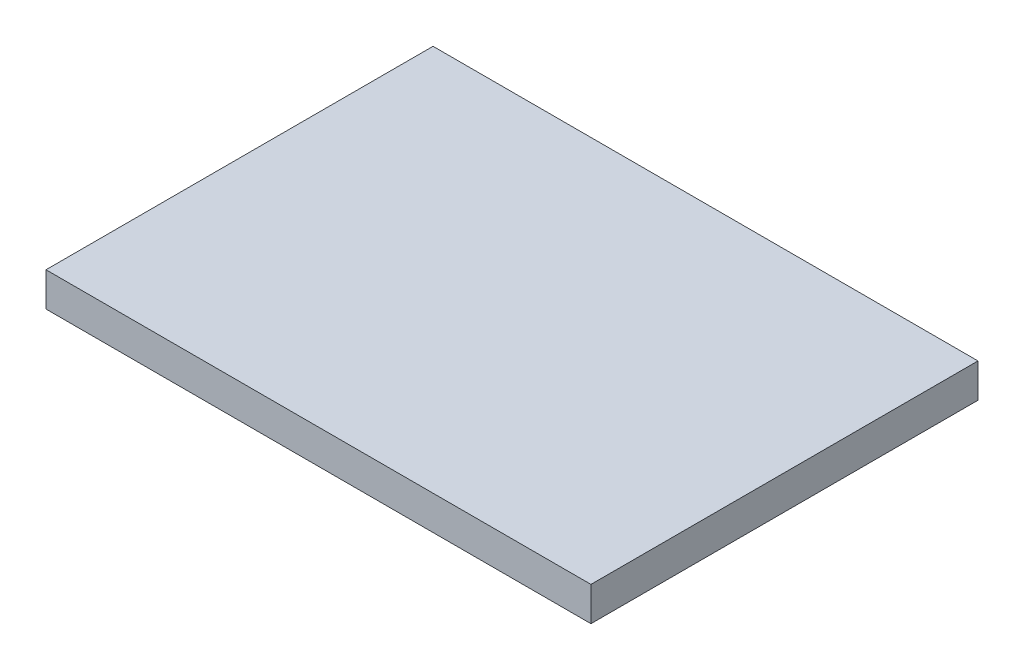
ISO-10303-21;
HEADER;
FILE_DESCRIPTION(('STEP AP214'),'2;1');
FILE_NAME('part.step','',(''),(''),'','','');
FILE_SCHEMA(('AUTOMOTIVE_DESIGN { 1 0 10303 214 1 1 1 1 }'));
ENDSEC;
DATA;
#1=APPLICATION_CONTEXT('core data for automotive mechanical design processes');
#2=APPLICATION_PROTOCOL_DEFINITION('international standard','automotive_design',2000,#1);
#3=PRODUCT_CONTEXT('',#1,'mechanical');
#4=PRODUCT('Part','Part','',(#3));
#5=PRODUCT_RELATED_PRODUCT_CATEGORY('part','',(#4));
#6=PRODUCT_DEFINITION_FORMATION('','',#4);
#7=PRODUCT_DEFINITION_CONTEXT('part definition',#1,'design');
#8=PRODUCT_DEFINITION('design','',#6,#7);
#9=PRODUCT_DEFINITION_SHAPE('','',#8);
#10=(LENGTH_UNIT() NAMED_UNIT(*) SI_UNIT(.MILLI.,.METRE.));
#11=(NAMED_UNIT(*) PLANE_ANGLE_UNIT() SI_UNIT($,.RADIAN.));
#12=(NAMED_UNIT(*) SI_UNIT($,.STERADIAN.) SOLID_ANGLE_UNIT());
#13=UNCERTAINTY_MEASURE_WITH_UNIT(LENGTH_MEASURE(1.E-05),#10,'distance_accuracy_value','');
#14=(GEOMETRIC_REPRESENTATION_CONTEXT(3) GLOBAL_UNCERTAINTY_ASSIGNED_CONTEXT((#13)) GLOBAL_UNIT_ASSIGNED_CONTEXT((#10,
#11,#12)) REPRESENTATION_CONTEXT('',''));
#15=CARTESIAN_POINT('',(0.,0.,0.));
#16=DIRECTION('',(0.,0.,1.));
#17=DIRECTION('',(1.,0.,0.));
#18=AXIS2_PLACEMENT_3D('',#15,#16,#17);
#19=CARTESIAN_POINT('',(8.8,1.1,6.25));
#20=DIRECTION('',(-1.,0.,0.));
#21=DIRECTION('',(0.,0.,1.));
#22=AXIS2_PLACEMENT_3D('',#19,#20,#21);
#23=PLANE('',#22);
#24=DIRECTION('',(0.,0.,-1.));
#25=VECTOR('',#24,1.);
#26=CARTESIAN_POINT('',(8.8,0.,6.25));
#27=LINE('',#26,#25);
#28=CARTESIAN_POINT('',(8.8,0.,6.25));
#29=VERTEX_POINT('',#28);
#30=CARTESIAN_POINT('',(8.8,0.,-6.25));
#31=VERTEX_POINT('',#30);
#32=EDGE_CURVE('E106',#29,#31,#27,.T.);
#33=ORIENTED_EDGE('',*,*,#32,.T.);
#34=DIRECTION('',(0.,-1.,0.));
#35=VECTOR('',#34,1.);
#36=CARTESIAN_POINT('',(8.8,1.1,-6.25));
#37=LINE('',#36,#35);
#38=CARTESIAN_POINT('',(8.8,1.1,-6.25));
#39=VERTEX_POINT('',#38);
#40=EDGE_CURVE('E11',#39,#31,#37,.T.);
#41=ORIENTED_EDGE('',*,*,#40,.F.);
#42=DIRECTION('',(0.,0.,-1.));
#43=VECTOR('',#42,1.);
#44=CARTESIAN_POINT('',(8.8,1.1,6.25));
#45=LINE('',#44,#43);
#46=CARTESIAN_POINT('',(8.8,1.1,6.25));
#47=VERTEX_POINT('',#46);
#48=EDGE_CURVE('E94',#47,#39,#45,.T.);
#49=ORIENTED_EDGE('',*,*,#48,.F.);
#50=DIRECTION('',(0.,-1.,0.));
#51=VECTOR('',#50,1.);
#52=CARTESIAN_POINT('',(8.8,1.1,6.25));
#53=LINE('',#52,#51);
#54=EDGE_CURVE('E102',#47,#29,#53,.T.);
#55=ORIENTED_EDGE('',*,*,#54,.T.);
#56=EDGE_LOOP('',(#33,#41,#49,#55));
#57=FACE_BOUND('',#56,.T.);
#58=ADVANCED_FACE('F43',(#57),#23,.F.);
#59=CARTESIAN_POINT('',(-8.8,1.1,-6.25));
#60=DIRECTION('',(0.,0.,1.));
#61=DIRECTION('',(1.,0.,0.));
#62=AXIS2_PLACEMENT_3D('',#59,#60,#61);
#63=PLANE('',#62);
#64=DIRECTION('',(-1.,0.,0.));
#65=VECTOR('',#64,1.);
#66=CARTESIAN_POINT('',(-8.8,0.,-6.25));
#67=LINE('',#66,#65);
#68=CARTESIAN_POINT('',(-8.8,0.,-6.25));
#69=VERTEX_POINT('',#68);
#70=EDGE_CURVE('E98',#31,#69,#67,.T.);
#71=ORIENTED_EDGE('',*,*,#70,.T.);
#72=DIRECTION('',(0.,-1.,0.));
#73=VECTOR('',#72,1.);
#74=CARTESIAN_POINT('',(-8.8,1.1,-6.25));
#75=LINE('',#74,#73);
#76=CARTESIAN_POINT('',(-8.8,1.1,-6.25));
#77=VERTEX_POINT('',#76);
#78=EDGE_CURVE('E51',#77,#69,#75,.T.);
#79=ORIENTED_EDGE('',*,*,#78,.F.);
#80=DIRECTION('',(-1.,0.,0.));
#81=VECTOR('',#80,1.);
#82=CARTESIAN_POINT('',(-8.8,1.1,-6.25));
#83=LINE('',#82,#81);
#84=EDGE_CURVE('E89',#39,#77,#83,.T.);
#85=ORIENTED_EDGE('',*,*,#84,.F.);
#86=ORIENTED_EDGE('',*,*,#40,.T.);
#87=EDGE_LOOP('',(#71,#79,#85,#86));
#88=FACE_BOUND('',#87,.T.);
#89=ADVANCED_FACE('F97',(#88),#63,.F.);
#90=CARTESIAN_POINT('',(-8.8,1.1,6.25));
#91=DIRECTION('',(1.,0.,0.));
#92=DIRECTION('',(0.,0.,-1.));
#93=AXIS2_PLACEMENT_3D('',#90,#91,#92);
#94=PLANE('',#93);
#95=DIRECTION('',(0.,0.,1.));
#96=VECTOR('',#95,1.);
#97=CARTESIAN_POINT('',(-8.8,0.,6.25));
#98=LINE('',#97,#96);
#99=CARTESIAN_POINT('',(-8.8,0.,6.25));
#100=VERTEX_POINT('',#99);
#101=EDGE_CURVE('E76',#69,#100,#98,.T.);
#102=ORIENTED_EDGE('',*,*,#101,.T.);
#103=DIRECTION('',(0.,-1.,0.));
#104=VECTOR('',#103,1.);
#105=CARTESIAN_POINT('',(-8.8,1.1,6.25));
#106=LINE('',#105,#104);
#107=CARTESIAN_POINT('',(-8.8,1.1,6.25));
#108=VERTEX_POINT('',#107);
#109=EDGE_CURVE('E99',#108,#100,#106,.T.);
#110=ORIENTED_EDGE('',*,*,#109,.F.);
#111=DIRECTION('',(0.,0.,1.));
#112=VECTOR('',#111,1.);
#113=CARTESIAN_POINT('',(-8.8,1.1,6.25));
#114=LINE('',#113,#112);
#115=EDGE_CURVE('E92',#77,#108,#114,.T.);
#116=ORIENTED_EDGE('',*,*,#115,.F.);
#117=ORIENTED_EDGE('',*,*,#78,.T.);
#118=EDGE_LOOP('',(#102,#110,#116,#117));
#119=FACE_BOUND('',#118,.T.);
#120=ADVANCED_FACE('F100',(#119),#94,.F.);
#121=CARTESIAN_POINT('',(-8.8,1.1,6.25));
#122=DIRECTION('',(0.,0.,-1.));
#123=DIRECTION('',(-1.,0.,0.));
#124=AXIS2_PLACEMENT_3D('',#121,#122,#123);
#125=PLANE('',#124);
#126=DIRECTION('',(1.,0.,0.));
#127=VECTOR('',#126,1.);
#128=CARTESIAN_POINT('',(-8.8,0.,6.25));
#129=LINE('',#128,#127);
#130=EDGE_CURVE('E82',#100,#29,#129,.T.);
#131=ORIENTED_EDGE('',*,*,#130,.T.);
#132=ORIENTED_EDGE('',*,*,#54,.F.);
#133=DIRECTION('',(1.,0.,0.));
#134=VECTOR('',#133,1.);
#135=CARTESIAN_POINT('',(-8.8,1.1,6.25));
#136=LINE('',#135,#134);
#137=EDGE_CURVE('E59',#108,#47,#136,.T.);
#138=ORIENTED_EDGE('',*,*,#137,.F.);
#139=ORIENTED_EDGE('',*,*,#109,.T.);
#140=EDGE_LOOP('',(#131,#132,#138,#139));
#141=FACE_BOUND('',#140,.T.);
#142=ADVANCED_FACE('F113',(#141),#125,.F.);
#143=CARTESIAN_POINT('',(0.,1.1,0.));
#144=DIRECTION('',(0.,-1.,0.));
#145=DIRECTION('',(0.,0.,-1.));
#146=AXIS2_PLACEMENT_3D('',#143,#144,#145);
#147=PLANE('',#146);
#148=ORIENTED_EDGE('',*,*,#48,.T.);
#149=ORIENTED_EDGE('',*,*,#84,.T.);
#150=ORIENTED_EDGE('',*,*,#115,.T.);
#151=ORIENTED_EDGE('',*,*,#137,.T.);
#152=EDGE_LOOP('',(#148,#149,#150,#151));
#153=FACE_BOUND('',#152,.T.);
#154=ADVANCED_FACE('F90',(#153),#147,.F.);
#155=CARTESIAN_POINT('',(0.,0.,0.));
#156=DIRECTION('',(0.,-1.,0.));
#157=DIRECTION('',(0.,0.,-1.));
#158=AXIS2_PLACEMENT_3D('',#155,#156,#157);
#159=PLANE('',#158);
#160=ORIENTED_EDGE('',*,*,#32,.F.);
#161=ORIENTED_EDGE('',*,*,#130,.F.);
#162=ORIENTED_EDGE('',*,*,#101,.F.);
#163=ORIENTED_EDGE('',*,*,#70,.F.);
#164=EDGE_LOOP('',(#160,#161,#162,#163));
#165=FACE_BOUND('',#164,.T.);
#166=ADVANCED_FACE('F116',(#165),#159,.T.);
#167=CLOSED_SHELL('',(#58,#89,#120,#142,#154,#166));
#168=MANIFOLD_SOLID_BREP('B2',#167);
#169=ADVANCED_BREP_SHAPE_REPRESENTATION('',(#18,#168),#14);
#170=SHAPE_DEFINITION_REPRESENTATION(#9,#169);
ENDSEC;
END-ISO-10303-21;
